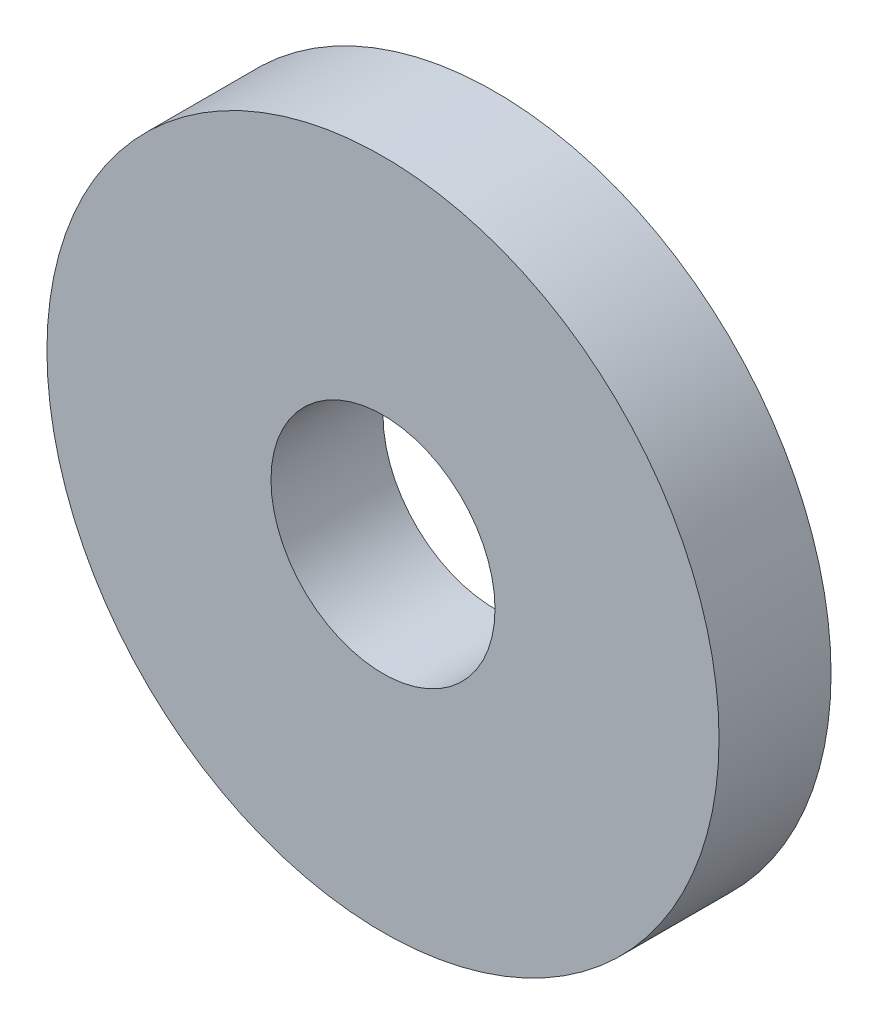
ISO-10303-21;
HEADER;
FILE_DESCRIPTION(('STEP AP214'),'2;1');
FILE_NAME('part.step','',(''),(''),'','','');
FILE_SCHEMA(('AUTOMOTIVE_DESIGN { 1 0 10303 214 1 1 1 1 }'));
ENDSEC;
DATA;
#1=APPLICATION_CONTEXT('core data for automotive mechanical design processes');
#2=APPLICATION_PROTOCOL_DEFINITION('international standard','automotive_design',2000,#1);
#3=PRODUCT_CONTEXT('',#1,'mechanical');
#4=PRODUCT('Part','Part','',(#3));
#5=PRODUCT_RELATED_PRODUCT_CATEGORY('part','',(#4));
#6=PRODUCT_DEFINITION_FORMATION('','',#4);
#7=PRODUCT_DEFINITION_CONTEXT('part definition',#1,'design');
#8=PRODUCT_DEFINITION('design','',#6,#7);
#9=PRODUCT_DEFINITION_SHAPE('','',#8);
#10=(LENGTH_UNIT() NAMED_UNIT(*) SI_UNIT(.MILLI.,.METRE.));
#11=(NAMED_UNIT(*) PLANE_ANGLE_UNIT() SI_UNIT($,.RADIAN.));
#12=(NAMED_UNIT(*) SI_UNIT($,.STERADIAN.) SOLID_ANGLE_UNIT());
#13=UNCERTAINTY_MEASURE_WITH_UNIT(LENGTH_MEASURE(1.E-05),#10,'distance_accuracy_value','');
#14=(GEOMETRIC_REPRESENTATION_CONTEXT(3) GLOBAL_UNCERTAINTY_ASSIGNED_CONTEXT((#13)) GLOBAL_UNIT_ASSIGNED_CONTEXT((#10,
#11,#12)) REPRESENTATION_CONTEXT('',''));
#15=CARTESIAN_POINT('',(0.,0.,0.));
#16=DIRECTION('',(0.,0.,1.));
#17=DIRECTION('',(1.,0.,0.));
#18=AXIS2_PLACEMENT_3D('',#15,#16,#17);
#19=CARTESIAN_POINT('',(0.,0.,2.5));
#20=DIRECTION('',(0.,0.,1.));
#21=DIRECTION('',(1.,0.,0.));
#22=AXIS2_PLACEMENT_3D('',#19,#20,#21);
#23=PLANE('',#22);
#24=CARTESIAN_POINT('',(0.,0.,2.5));
#25=DIRECTION('',(0.,0.,1.));
#26=DIRECTION('',(1.,0.,0.));
#27=AXIS2_PLACEMENT_3D('',#24,#25,#26);
#28=CIRCLE('',#27,7.5);
#29=CARTESIAN_POINT('',(7.5,0.,2.5));
#30=VERTEX_POINT('',#29);
#31=EDGE_CURVE('E10',#30,#30,#28,.T.);
#32=ORIENTED_EDGE('',*,*,#31,.T.);
#33=EDGE_LOOP('',(#32));
#34=FACE_BOUND('',#33,.T.);
#35=CARTESIAN_POINT('',(0.,0.,2.5));
#36=DIRECTION('',(0.,0.,1.));
#37=DIRECTION('',(1.,0.,0.));
#38=AXIS2_PLACEMENT_3D('',#35,#36,#37);
#39=CIRCLE('',#38,2.5);
#40=CARTESIAN_POINT('',(2.5,0.,2.5));
#41=VERTEX_POINT('',#40);
#42=EDGE_CURVE('E56',#41,#41,#39,.T.);
#43=ORIENTED_EDGE('',*,*,#42,.F.);
#44=EDGE_LOOP('',(#43));
#45=FACE_BOUND('',#44,.T.);
#46=ADVANCED_FACE('F43',(#34,#45),#23,.T.);
#47=CARTESIAN_POINT('',(0.,0.,0.));
#48=DIRECTION('',(0.,0.,1.));
#49=DIRECTION('',(1.,0.,0.));
#50=AXIS2_PLACEMENT_3D('',#47,#48,#49);
#51=PLANE('',#50);
#52=CARTESIAN_POINT('',(0.,0.,0.));
#53=DIRECTION('',(0.,0.,1.));
#54=DIRECTION('',(1.,0.,0.));
#55=AXIS2_PLACEMENT_3D('',#52,#53,#54);
#56=CIRCLE('',#55,7.5);
#57=CARTESIAN_POINT('',(7.5,0.,0.));
#58=VERTEX_POINT('',#57);
#59=EDGE_CURVE('E47',#58,#58,#56,.T.);
#60=ORIENTED_EDGE('',*,*,#59,.F.);
#61=EDGE_LOOP('',(#60));
#62=FACE_BOUND('',#61,.T.);
#63=CARTESIAN_POINT('',(0.,0.,0.));
#64=DIRECTION('',(0.,0.,1.));
#65=DIRECTION('',(1.,0.,0.));
#66=AXIS2_PLACEMENT_3D('',#63,#64,#65);
#67=CIRCLE('',#66,2.5);
#68=CARTESIAN_POINT('',(2.5,0.,0.));
#69=VERTEX_POINT('',#68);
#70=EDGE_CURVE('E58',#69,#69,#67,.T.);
#71=ORIENTED_EDGE('',*,*,#70,.T.);
#72=EDGE_LOOP('',(#71));
#73=FACE_BOUND('',#72,.T.);
#74=ADVANCED_FACE('F70',(#62,#73),#51,.F.);
#75=CARTESIAN_POINT('',(0.,0.,2.5));
#76=DIRECTION('',(0.,0.,-1.));
#77=DIRECTION('',(-1.,0.,0.));
#78=AXIS2_PLACEMENT_3D('',#75,#76,#77);
#79=CYLINDRICAL_SURFACE('',#78,7.5);
#80=ORIENTED_EDGE('',*,*,#31,.F.);
#81=EDGE_LOOP('',(#80));
#82=FACE_BOUND('',#81,.T.);
#83=ORIENTED_EDGE('',*,*,#59,.T.);
#84=EDGE_LOOP('',(#83));
#85=FACE_BOUND('',#84,.T.);
#86=ADVANCED_FACE('F45',(#82,#85),#79,.T.);
#87=CARTESIAN_POINT('',(0.,0.,2.5));
#88=DIRECTION('',(0.,0.,-1.));
#89=DIRECTION('',(-1.,0.,0.));
#90=AXIS2_PLACEMENT_3D('',#87,#88,#89);
#91=CYLINDRICAL_SURFACE('',#90,2.5);
#92=ORIENTED_EDGE('',*,*,#42,.T.);
#93=EDGE_LOOP('',(#92));
#94=FACE_BOUND('',#93,.T.);
#95=ORIENTED_EDGE('',*,*,#70,.F.);
#96=EDGE_LOOP('',(#95));
#97=FACE_BOUND('',#96,.T.);
#98=ADVANCED_FACE('F66',(#94,#97),#91,.F.);
#99=CLOSED_SHELL('',(#46,#74,#86,#98));
#100=MANIFOLD_SOLID_BREP('B2',#99);
#101=ADVANCED_BREP_SHAPE_REPRESENTATION('',(#18,#100),#14);
#102=SHAPE_DEFINITION_REPRESENTATION(#9,#101);
ENDSEC;
END-ISO-10303-21;
